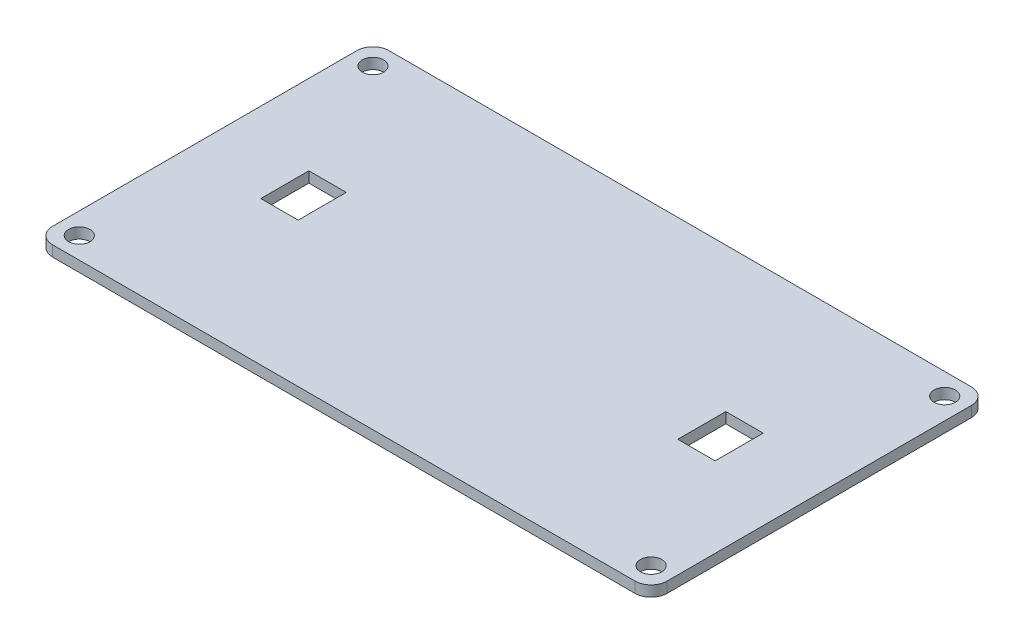
ISO-10303-21;
HEADER;
FILE_DESCRIPTION(('STEP AP214'),'2;1');
FILE_NAME('part.step','',(''),(''),'','','');
FILE_SCHEMA(('AUTOMOTIVE_DESIGN { 1 0 10303 214 1 1 1 1 }'));
ENDSEC;
DATA;
#1=APPLICATION_CONTEXT('core data for automotive mechanical design processes');
#2=APPLICATION_PROTOCOL_DEFINITION('international standard','automotive_design',2000,#1);
#3=PRODUCT_CONTEXT('',#1,'mechanical');
#4=PRODUCT('Part','Part','',(#3));
#5=PRODUCT_RELATED_PRODUCT_CATEGORY('part','',(#4));
#6=PRODUCT_DEFINITION_FORMATION('','',#4);
#7=PRODUCT_DEFINITION_CONTEXT('part definition',#1,'design');
#8=PRODUCT_DEFINITION('design','',#6,#7);
#9=PRODUCT_DEFINITION_SHAPE('','',#8);
#10=(LENGTH_UNIT() NAMED_UNIT(*) SI_UNIT(.MILLI.,.METRE.));
#11=(NAMED_UNIT(*) PLANE_ANGLE_UNIT() SI_UNIT($,.RADIAN.));
#12=(NAMED_UNIT(*) SI_UNIT($,.STERADIAN.) SOLID_ANGLE_UNIT());
#13=UNCERTAINTY_MEASURE_WITH_UNIT(LENGTH_MEASURE(1.E-05),#10,'distance_accuracy_value','');
#14=(GEOMETRIC_REPRESENTATION_CONTEXT(3) GLOBAL_UNCERTAINTY_ASSIGNED_CONTEXT((#13)) GLOBAL_UNIT_ASSIGNED_CONTEXT((#10,
#11,#12)) REPRESENTATION_CONTEXT('',''));
#15=CARTESIAN_POINT('',(0.,0.,0.));
#16=DIRECTION('',(0.,0.,1.));
#17=DIRECTION('',(1.,0.,0.));
#18=AXIS2_PLACEMENT_3D('',#15,#16,#17);
#19=CARTESIAN_POINT('',(-57.5483884452991,2.,31.5));
#20=DIRECTION('',(1.,0.,0.));
#21=DIRECTION('',(0.,0.,-1.));
#22=AXIS2_PLACEMENT_3D('',#19,#20,#21);
#23=PLANE('',#22);
#24=DIRECTION('',(0.,0.,1.));
#25=VECTOR('',#24,1.);
#26=CARTESIAN_POINT('',(-57.5483884452991,0.,31.5));
#27=LINE('',#26,#25);
#28=CARTESIAN_POINT('',(-57.5483884452991,0.,-28.5));
#29=VERTEX_POINT('',#28);
#30=CARTESIAN_POINT('',(-57.5483884452991,0.,28.5));
#31=VERTEX_POINT('',#30);
#32=EDGE_CURVE('E280',#29,#31,#27,.T.);
#33=ORIENTED_EDGE('',*,*,#32,.T.);
#34=DIRECTION('',(0.,-1.,0.));
#35=VECTOR('',#34,1.);
#36=CARTESIAN_POINT('',(-57.5483884452991,2.,28.5));
#37=LINE('',#36,#35);
#38=CARTESIAN_POINT('',(-57.5483884452991,2.,28.5));
#39=VERTEX_POINT('',#38);
#40=EDGE_CURVE('E11',#31,#39,#37,.F.);
#41=ORIENTED_EDGE('',*,*,#40,.T.);
#42=DIRECTION('',(0.,0.,1.));
#43=VECTOR('',#42,1.);
#44=CARTESIAN_POINT('',(-57.5483884452991,2.,31.5));
#45=LINE('',#44,#43);
#46=CARTESIAN_POINT('',(-57.5483884452991,2.,-28.5));
#47=VERTEX_POINT('',#46);
#48=EDGE_CURVE('E284',#47,#39,#45,.T.);
#49=ORIENTED_EDGE('',*,*,#48,.F.);
#50=DIRECTION('',(0.,-1.,0.));
#51=VECTOR('',#50,1.);
#52=CARTESIAN_POINT('',(-57.5483884452991,2.,-28.5));
#53=LINE('',#52,#51);
#54=EDGE_CURVE('E48',#47,#29,#53,.T.);
#55=ORIENTED_EDGE('',*,*,#54,.T.);
#56=EDGE_LOOP('',(#33,#41,#49,#55));
#57=FACE_BOUND('',#56,.T.);
#58=ADVANCED_FACE('F39',(#57),#23,.F.);
#59=CARTESIAN_POINT('',(57.548388445299,2.,31.5));
#60=DIRECTION('',(0.,0.,-1.));
#61=DIRECTION('',(-1.,0.,0.));
#62=AXIS2_PLACEMENT_3D('',#59,#60,#61);
#63=PLANE('',#62);
#64=DIRECTION('',(1.,0.,0.));
#65=VECTOR('',#64,1.);
#66=CARTESIAN_POINT('',(57.548388445299,0.,31.5));
#67=LINE('',#66,#65);
#68=CARTESIAN_POINT('',(-54.5483884452991,0.,31.5));
#69=VERTEX_POINT('',#68);
#70=CARTESIAN_POINT('',(54.548388445299,0.,31.5));
#71=VERTEX_POINT('',#70);
#72=EDGE_CURVE('E305',#69,#71,#67,.T.);
#73=ORIENTED_EDGE('',*,*,#72,.T.);
#74=DIRECTION('',(0.,-1.,0.));
#75=VECTOR('',#74,1.);
#76=CARTESIAN_POINT('',(54.548388445299,2.,31.5));
#77=LINE('',#76,#75);
#78=CARTESIAN_POINT('',(54.548388445299,2.,31.5));
#79=VERTEX_POINT('',#78);
#80=EDGE_CURVE('E357',#71,#79,#77,.F.);
#81=ORIENTED_EDGE('',*,*,#80,.T.);
#82=DIRECTION('',(1.,0.,0.));
#83=VECTOR('',#82,1.);
#84=CARTESIAN_POINT('',(57.548388445299,2.,31.5));
#85=LINE('',#84,#83);
#86=CARTESIAN_POINT('',(-54.5483884452991,2.,31.5));
#87=VERTEX_POINT('',#86);
#88=EDGE_CURVE('E288',#87,#79,#85,.T.);
#89=ORIENTED_EDGE('',*,*,#88,.F.);
#90=DIRECTION('',(0.,-1.,0.));
#91=VECTOR('',#90,1.);
#92=CARTESIAN_POINT('',(-54.5483884452991,2.,31.5));
#93=LINE('',#92,#91);
#94=EDGE_CURVE('E353',#87,#69,#93,.T.);
#95=ORIENTED_EDGE('',*,*,#94,.T.);
#96=EDGE_LOOP('',(#73,#81,#89,#95));
#97=FACE_BOUND('',#96,.T.);
#98=ADVANCED_FACE('F377',(#97),#63,.F.);
#99=CARTESIAN_POINT('',(57.548388445299,2.,-31.5));
#100=DIRECTION('',(-1.,0.,0.));
#101=DIRECTION('',(0.,0.,1.));
#102=AXIS2_PLACEMENT_3D('',#99,#100,#101);
#103=PLANE('',#102);
#104=DIRECTION('',(0.,0.,-1.));
#105=VECTOR('',#104,1.);
#106=CARTESIAN_POINT('',(57.548388445299,0.,-31.5));
#107=LINE('',#106,#105);
#108=CARTESIAN_POINT('',(57.548388445299,0.,28.5));
#109=VERTEX_POINT('',#108);
#110=CARTESIAN_POINT('',(57.548388445299,0.,-28.5));
#111=VERTEX_POINT('',#110);
#112=EDGE_CURVE('E309',#109,#111,#107,.T.);
#113=ORIENTED_EDGE('',*,*,#112,.T.);
#114=DIRECTION('',(0.,-1.,0.));
#115=VECTOR('',#114,1.);
#116=CARTESIAN_POINT('',(57.548388445299,2.,-28.5));
#117=LINE('',#116,#115);
#118=CARTESIAN_POINT('',(57.548388445299,2.,-28.5));
#119=VERTEX_POINT('',#118);
#120=EDGE_CURVE('E338',#111,#119,#117,.F.);
#121=ORIENTED_EDGE('',*,*,#120,.T.);
#122=DIRECTION('',(0.,0.,-1.));
#123=VECTOR('',#122,1.);
#124=CARTESIAN_POINT('',(57.548388445299,2.,-31.5));
#125=LINE('',#124,#123);
#126=CARTESIAN_POINT('',(57.548388445299,2.,28.5));
#127=VERTEX_POINT('',#126);
#128=EDGE_CURVE('E293',#127,#119,#125,.T.);
#129=ORIENTED_EDGE('',*,*,#128,.F.);
#130=DIRECTION('',(0.,-1.,0.));
#131=VECTOR('',#130,1.);
#132=CARTESIAN_POINT('',(57.548388445299,2.,28.5));
#133=LINE('',#132,#131);
#134=EDGE_CURVE('E334',#127,#109,#133,.T.);
#135=ORIENTED_EDGE('',*,*,#134,.T.);
#136=EDGE_LOOP('',(#113,#121,#129,#135));
#137=FACE_BOUND('',#136,.T.);
#138=ADVANCED_FACE('F388',(#137),#103,.F.);
#139=CARTESIAN_POINT('',(-57.5483884452991,2.,-31.5));
#140=DIRECTION('',(0.,0.,1.));
#141=DIRECTION('',(1.,0.,0.));
#142=AXIS2_PLACEMENT_3D('',#139,#140,#141);
#143=PLANE('',#142);
#144=DIRECTION('',(-1.,0.,0.));
#145=VECTOR('',#144,1.);
#146=CARTESIAN_POINT('',(-57.5483884452991,2.,-31.5));
#147=LINE('',#146,#145);
#148=CARTESIAN_POINT('',(54.548388445299,2.,-31.5));
#149=VERTEX_POINT('',#148);
#150=CARTESIAN_POINT('',(-54.5483884452991,2.,-31.5));
#151=VERTEX_POINT('',#150);
#152=EDGE_CURVE('E297',#149,#151,#147,.T.);
#153=ORIENTED_EDGE('',*,*,#152,.F.);
#154=DIRECTION('',(0.,-1.,0.));
#155=VECTOR('',#154,1.);
#156=CARTESIAN_POINT('',(54.548388445299,2.,-31.5));
#157=LINE('',#156,#155);
#158=CARTESIAN_POINT('',(54.548388445299,0.,-31.5));
#159=VERTEX_POINT('',#158);
#160=EDGE_CURVE('E318',#149,#159,#157,.T.);
#161=ORIENTED_EDGE('',*,*,#160,.T.);
#162=DIRECTION('',(-1.,0.,0.));
#163=VECTOR('',#162,1.);
#164=CARTESIAN_POINT('',(-57.5483884452991,0.,-31.5));
#165=LINE('',#164,#163);
#166=CARTESIAN_POINT('',(-54.5483884452991,0.,-31.5));
#167=VERTEX_POINT('',#166);
#168=EDGE_CURVE('E289',#159,#167,#165,.T.);
#169=ORIENTED_EDGE('',*,*,#168,.T.);
#170=DIRECTION('',(0.,-1.,0.));
#171=VECTOR('',#170,1.);
#172=CARTESIAN_POINT('',(-54.5483884452991,2.,-31.5));
#173=LINE('',#172,#171);
#174=EDGE_CURVE('E301',#167,#151,#173,.F.);
#175=ORIENTED_EDGE('',*,*,#174,.T.);
#176=EDGE_LOOP('',(#153,#161,#169,#175));
#177=FACE_BOUND('',#176,.T.);
#178=ADVANCED_FACE('F396',(#177),#143,.F.);
#179=CARTESIAN_POINT('',(0.,2.,0.));
#180=DIRECTION('',(0.,-1.,0.));
#181=DIRECTION('',(0.,0.,-1.));
#182=AXIS2_PLACEMENT_3D('',#179,#180,#181);
#183=PLANE('',#182);
#184=DIRECTION('',(0.,0.,-1.));
#185=VECTOR('',#184,1.);
#186=CARTESIAN_POINT('',(-42.5483884452991,2.,0.));
#187=LINE('',#186,#185);
#188=CARTESIAN_POINT('',(-42.5483884452991,2.,4.5));
#189=VERTEX_POINT('',#188);
#190=CARTESIAN_POINT('',(-42.5483884452991,2.,-4.5));
#191=VERTEX_POINT('',#190);
#192=EDGE_CURVE('E238',#189,#191,#187,.T.);
#193=ORIENTED_EDGE('',*,*,#192,.T.);
#194=DIRECTION('',(1.,0.,0.));
#195=VECTOR('',#194,1.);
#196=CARTESIAN_POINT('',(0.,2.,-4.5));
#197=LINE('',#196,#195);
#198=CARTESIAN_POINT('',(-35.5483884452991,2.,-4.5));
#199=VERTEX_POINT('',#198);
#200=EDGE_CURVE('E157',#191,#199,#197,.T.);
#201=ORIENTED_EDGE('',*,*,#200,.T.);
#202=DIRECTION('',(0.,0.,1.));
#203=VECTOR('',#202,1.);
#204=CARTESIAN_POINT('',(-35.5483884452991,2.,0.));
#205=LINE('',#204,#203);
#206=CARTESIAN_POINT('',(-35.5483884452991,2.,4.5));
#207=VERTEX_POINT('',#206);
#208=EDGE_CURVE('E245',#199,#207,#205,.T.);
#209=ORIENTED_EDGE('',*,*,#208,.T.);
#210=DIRECTION('',(-1.,0.,0.));
#211=VECTOR('',#210,1.);
#212=CARTESIAN_POINT('',(0.,2.,4.5));
#213=LINE('',#212,#211);
#214=EDGE_CURVE('E241',#207,#189,#213,.T.);
#215=ORIENTED_EDGE('',*,*,#214,.T.);
#216=EDGE_LOOP('',(#193,#201,#209,#215));
#217=FACE_BOUND('',#216,.T.);
#218=DIRECTION('',(-1.,0.,0.));
#219=VECTOR('',#218,1.);
#220=CARTESIAN_POINT('',(0.,2.,4.5));
#221=LINE('',#220,#219);
#222=CARTESIAN_POINT('',(42.5483884452991,2.,4.5));
#223=VERTEX_POINT('',#222);
#224=CARTESIAN_POINT('',(35.5483884452991,2.,4.5));
#225=VERTEX_POINT('',#224);
#226=EDGE_CURVE('E191',#223,#225,#221,.T.);
#227=ORIENTED_EDGE('',*,*,#226,.T.);
#228=DIRECTION('',(0.,0.,-1.));
#229=VECTOR('',#228,1.);
#230=CARTESIAN_POINT('',(35.5483884452991,2.,0.));
#231=LINE('',#230,#229);
#232=CARTESIAN_POINT('',(35.5483884452991,2.,-4.5));
#233=VERTEX_POINT('',#232);
#234=EDGE_CURVE('E234',#225,#233,#231,.T.);
#235=ORIENTED_EDGE('',*,*,#234,.T.);
#236=DIRECTION('',(1.,0.,0.));
#237=VECTOR('',#236,1.);
#238=CARTESIAN_POINT('',(0.,2.,-4.5));
#239=LINE('',#238,#237);
#240=CARTESIAN_POINT('',(42.5483884452991,2.,-4.5));
#241=VERTEX_POINT('',#240);
#242=EDGE_CURVE('E230',#233,#241,#239,.T.);
#243=ORIENTED_EDGE('',*,*,#242,.T.);
#244=DIRECTION('',(0.,0.,1.));
#245=VECTOR('',#244,1.);
#246=CARTESIAN_POINT('',(42.5483884452991,2.,0.));
#247=LINE('',#246,#245);
#248=EDGE_CURVE('E226',#241,#223,#247,.T.);
#249=ORIENTED_EDGE('',*,*,#248,.T.);
#250=EDGE_LOOP('',(#227,#235,#243,#249));
#251=FACE_BOUND('',#250,.T.);
#252=CARTESIAN_POINT('',(-53.548388445299,2.,-27.5));
#253=DIRECTION('',(0.,1.,0.));
#254=DIRECTION('',(0.,0.,-1.));
#255=AXIS2_PLACEMENT_3D('',#252,#253,#254);
#256=CIRCLE('',#255,2.);
#257=CARTESIAN_POINT('',(-53.548388445299,2.,-29.5));
#258=VERTEX_POINT('',#257);
#259=EDGE_CURVE('E251',#258,#258,#256,.T.);
#260=ORIENTED_EDGE('',*,*,#259,.F.);
#261=EDGE_LOOP('',(#260));
#262=FACE_BOUND('',#261,.T.);
#263=CARTESIAN_POINT('',(-53.548388445299,2.,27.5));
#264=DIRECTION('',(0.,1.,0.));
#265=DIRECTION('',(0.,0.,1.));
#266=AXIS2_PLACEMENT_3D('',#263,#264,#265);
#267=CIRCLE('',#266,2.);
#268=CARTESIAN_POINT('',(-53.548388445299,2.,29.5));
#269=VERTEX_POINT('',#268);
#270=EDGE_CURVE('E265',#269,#269,#267,.T.);
#271=ORIENTED_EDGE('',*,*,#270,.F.);
#272=EDGE_LOOP('',(#271));
#273=FACE_BOUND('',#272,.T.);
#274=CARTESIAN_POINT('',(53.548388445299,2.,27.5));
#275=DIRECTION('',(0.,1.,0.));
#276=DIRECTION('',(0.,0.,-1.));
#277=AXIS2_PLACEMENT_3D('',#274,#275,#276);
#278=CIRCLE('',#277,2.);
#279=CARTESIAN_POINT('',(53.548388445299,2.,25.5));
#280=VERTEX_POINT('',#279);
#281=EDGE_CURVE('E257',#280,#280,#278,.T.);
#282=ORIENTED_EDGE('',*,*,#281,.F.);
#283=EDGE_LOOP('',(#282));
#284=FACE_BOUND('',#283,.T.);
#285=CARTESIAN_POINT('',(53.548388445299,2.,-27.5));
#286=DIRECTION('',(0.,1.,0.));
#287=DIRECTION('',(0.,0.,1.));
#288=AXIS2_PLACEMENT_3D('',#285,#286,#287);
#289=CIRCLE('',#288,2.);
#290=CARTESIAN_POINT('',(53.548388445299,2.,-25.5));
#291=VERTEX_POINT('',#290);
#292=EDGE_CURVE('E256',#291,#291,#289,.T.);
#293=ORIENTED_EDGE('',*,*,#292,.F.);
#294=EDGE_LOOP('',(#293));
#295=FACE_BOUND('',#294,.T.);
#296=ORIENTED_EDGE('',*,*,#128,.T.);
#297=CARTESIAN_POINT('',(54.548388445299,2.,-28.5));
#298=DIRECTION('',(0.,-1.,0.));
#299=DIRECTION('',(0.,0.,-1.));
#300=AXIS2_PLACEMENT_3D('',#297,#298,#299);
#301=CIRCLE('',#300,3.);
#302=EDGE_CURVE('E350',#119,#149,#301,.F.);
#303=ORIENTED_EDGE('',*,*,#302,.T.);
#304=ORIENTED_EDGE('',*,*,#152,.T.);
#305=CARTESIAN_POINT('',(-54.5483884452991,2.,-28.5));
#306=DIRECTION('',(0.,-1.,0.));
#307=DIRECTION('',(0.,0.,-1.));
#308=AXIS2_PLACEMENT_3D('',#305,#306,#307);
#309=CIRCLE('',#308,3.);
#310=EDGE_CURVE('E341',#151,#47,#309,.F.);
#311=ORIENTED_EDGE('',*,*,#310,.T.);
#312=ORIENTED_EDGE('',*,*,#48,.T.);
#313=CARTESIAN_POINT('',(-54.5483884452991,2.,28.5));
#314=DIRECTION('',(0.,-1.,0.));
#315=DIRECTION('',(0.,0.,-1.));
#316=AXIS2_PLACEMENT_3D('',#313,#314,#315);
#317=CIRCLE('',#316,3.);
#318=EDGE_CURVE('E344',#39,#87,#317,.F.);
#319=ORIENTED_EDGE('',*,*,#318,.T.);
#320=ORIENTED_EDGE('',*,*,#88,.T.);
#321=CARTESIAN_POINT('',(54.548388445299,2.,28.5));
#322=DIRECTION('',(0.,-1.,0.));
#323=DIRECTION('',(0.,0.,-1.));
#324=AXIS2_PLACEMENT_3D('',#321,#322,#323);
#325=CIRCLE('',#324,3.);
#326=EDGE_CURVE('E347',#79,#127,#325,.F.);
#327=ORIENTED_EDGE('',*,*,#326,.T.);
#328=EDGE_LOOP('',(#296,#303,#304,#311,#312,#319,#320,#327));
#329=FACE_BOUND('',#328,.T.);
#330=ADVANCED_FACE('F381',(#217,#251,#262,#273,#284,#295,#329),#183,.F.);
#331=CARTESIAN_POINT('',(0.,0.,0.));
#332=DIRECTION('',(0.,-1.,0.));
#333=DIRECTION('',(0.,0.,-1.));
#334=AXIS2_PLACEMENT_3D('',#331,#332,#333);
#335=PLANE('',#334);
#336=DIRECTION('',(-1.,0.,0.));
#337=VECTOR('',#336,1.);
#338=CARTESIAN_POINT('',(-42.5483884452991,0.,-4.5));
#339=LINE('',#338,#337);
#340=CARTESIAN_POINT('',(-35.5483884452991,0.,-4.5));
#341=VERTEX_POINT('',#340);
#342=CARTESIAN_POINT('',(-42.5483884452991,0.,-4.5));
#343=VERTEX_POINT('',#342);
#344=EDGE_CURVE('E154',#341,#343,#339,.T.);
#345=ORIENTED_EDGE('',*,*,#344,.T.);
#346=DIRECTION('',(0.,0.,1.));
#347=VECTOR('',#346,1.);
#348=CARTESIAN_POINT('',(-42.5483884452991,0.,4.5));
#349=LINE('',#348,#347);
#350=CARTESIAN_POINT('',(-42.5483884452991,0.,4.5));
#351=VERTEX_POINT('',#350);
#352=EDGE_CURVE('E165',#343,#351,#349,.T.);
#353=ORIENTED_EDGE('',*,*,#352,.T.);
#354=DIRECTION('',(1.,0.,0.));
#355=VECTOR('',#354,1.);
#356=CARTESIAN_POINT('',(-35.5483884452991,0.,4.5));
#357=LINE('',#356,#355);
#358=CARTESIAN_POINT('',(-35.5483884452991,0.,4.5));
#359=VERTEX_POINT('',#358);
#360=EDGE_CURVE('E171',#351,#359,#357,.T.);
#361=ORIENTED_EDGE('',*,*,#360,.T.);
#362=DIRECTION('',(0.,0.,-1.));
#363=VECTOR('',#362,1.);
#364=CARTESIAN_POINT('',(-35.5483884452991,0.,-4.5));
#365=LINE('',#364,#363);
#366=EDGE_CURVE('E161',#359,#341,#365,.T.);
#367=ORIENTED_EDGE('',*,*,#366,.T.);
#368=EDGE_LOOP('',(#345,#353,#361,#367));
#369=FACE_BOUND('',#368,.T.);
#370=DIRECTION('',(0.,0.,1.));
#371=VECTOR('',#370,1.);
#372=CARTESIAN_POINT('',(35.5483884452991,0.,-4.5));
#373=LINE('',#372,#371);
#374=CARTESIAN_POINT('',(35.5483884452991,0.,-4.5));
#375=VERTEX_POINT('',#374);
#376=CARTESIAN_POINT('',(35.5483884452991,0.,4.5));
#377=VERTEX_POINT('',#376);
#378=EDGE_CURVE('E198',#375,#377,#373,.T.);
#379=ORIENTED_EDGE('',*,*,#378,.T.);
#380=DIRECTION('',(1.,0.,0.));
#381=VECTOR('',#380,1.);
#382=CARTESIAN_POINT('',(35.5483884452991,0.,4.5));
#383=LINE('',#382,#381);
#384=CARTESIAN_POINT('',(42.5483884452991,0.,4.5));
#385=VERTEX_POINT('',#384);
#386=EDGE_CURVE('E202',#377,#385,#383,.T.);
#387=ORIENTED_EDGE('',*,*,#386,.T.);
#388=DIRECTION('',(0.,0.,-1.));
#389=VECTOR('',#388,1.);
#390=CARTESIAN_POINT('',(42.5483884452991,0.,4.5));
#391=LINE('',#390,#389);
#392=CARTESIAN_POINT('',(42.5483884452991,0.,-4.5));
#393=VERTEX_POINT('',#392);
#394=EDGE_CURVE('E206',#385,#393,#391,.T.);
#395=ORIENTED_EDGE('',*,*,#394,.T.);
#396=DIRECTION('',(-1.,0.,0.));
#397=VECTOR('',#396,1.);
#398=CARTESIAN_POINT('',(42.5483884452991,0.,-4.5));
#399=LINE('',#398,#397);
#400=EDGE_CURVE('E210',#393,#375,#399,.T.);
#401=ORIENTED_EDGE('',*,*,#400,.T.);
#402=EDGE_LOOP('',(#379,#387,#395,#401));
#403=FACE_BOUND('',#402,.T.);
#404=CARTESIAN_POINT('',(-53.548388445299,0.,-27.5));
#405=DIRECTION('',(0.,1.,0.));
#406=DIRECTION('',(0.,0.,-1.));
#407=AXIS2_PLACEMENT_3D('',#404,#405,#406);
#408=CIRCLE('',#407,2.);
#409=CARTESIAN_POINT('',(-53.548388445299,0.,-29.5));
#410=VERTEX_POINT('',#409);
#411=EDGE_CURVE('E269',#410,#410,#408,.T.);
#412=ORIENTED_EDGE('',*,*,#411,.T.);
#413=EDGE_LOOP('',(#412));
#414=FACE_BOUND('',#413,.T.);
#415=CARTESIAN_POINT('',(-53.548388445299,0.,27.5));
#416=DIRECTION('',(0.,1.,0.));
#417=DIRECTION('',(0.,0.,1.));
#418=AXIS2_PLACEMENT_3D('',#415,#416,#417);
#419=CIRCLE('',#418,2.);
#420=CARTESIAN_POINT('',(-53.548388445299,0.,29.5));
#421=VERTEX_POINT('',#420);
#422=EDGE_CURVE('E261',#421,#421,#419,.T.);
#423=ORIENTED_EDGE('',*,*,#422,.T.);
#424=EDGE_LOOP('',(#423));
#425=FACE_BOUND('',#424,.T.);
#426=CARTESIAN_POINT('',(53.548388445299,0.,27.5));
#427=DIRECTION('',(0.,1.,0.));
#428=DIRECTION('',(0.,0.,-1.));
#429=AXIS2_PLACEMENT_3D('',#426,#427,#428);
#430=CIRCLE('',#429,2.);
#431=CARTESIAN_POINT('',(53.548388445299,0.,25.5));
#432=VERTEX_POINT('',#431);
#433=EDGE_CURVE('E252',#432,#432,#430,.T.);
#434=ORIENTED_EDGE('',*,*,#433,.T.);
#435=EDGE_LOOP('',(#434));
#436=FACE_BOUND('',#435,.T.);
#437=CARTESIAN_POINT('',(53.548388445299,0.,-27.5));
#438=DIRECTION('',(0.,1.,0.));
#439=DIRECTION('',(0.,0.,1.));
#440=AXIS2_PLACEMENT_3D('',#437,#438,#439);
#441=CIRCLE('',#440,2.);
#442=CARTESIAN_POINT('',(53.548388445299,0.,-25.5));
#443=VERTEX_POINT('',#442);
#444=EDGE_CURVE('E276',#443,#443,#441,.T.);
#445=ORIENTED_EDGE('',*,*,#444,.T.);
#446=EDGE_LOOP('',(#445));
#447=FACE_BOUND('',#446,.T.);
#448=ORIENTED_EDGE('',*,*,#168,.F.);
#449=CARTESIAN_POINT('',(54.548388445299,0.,-28.5));
#450=DIRECTION('',(0.,-1.,0.));
#451=DIRECTION('',(0.,0.,-1.));
#452=AXIS2_PLACEMENT_3D('',#449,#450,#451);
#453=CIRCLE('',#452,3.);
#454=EDGE_CURVE('E331',#159,#111,#453,.T.);
#455=ORIENTED_EDGE('',*,*,#454,.T.);
#456=ORIENTED_EDGE('',*,*,#112,.F.);
#457=CARTESIAN_POINT('',(54.548388445299,0.,28.5));
#458=DIRECTION('',(0.,-1.,0.));
#459=DIRECTION('',(0.,0.,-1.));
#460=AXIS2_PLACEMENT_3D('',#457,#458,#459);
#461=CIRCLE('',#460,3.);
#462=EDGE_CURVE('E328',#109,#71,#461,.T.);
#463=ORIENTED_EDGE('',*,*,#462,.T.);
#464=ORIENTED_EDGE('',*,*,#72,.F.);
#465=CARTESIAN_POINT('',(-54.5483884452991,0.,28.5));
#466=DIRECTION('',(0.,-1.,0.));
#467=DIRECTION('',(0.,0.,-1.));
#468=AXIS2_PLACEMENT_3D('',#465,#466,#467);
#469=CIRCLE('',#468,3.);
#470=EDGE_CURVE('E325',#69,#31,#469,.T.);
#471=ORIENTED_EDGE('',*,*,#470,.T.);
#472=ORIENTED_EDGE('',*,*,#32,.F.);
#473=CARTESIAN_POINT('',(-54.5483884452991,0.,-28.5));
#474=DIRECTION('',(0.,-1.,0.));
#475=DIRECTION('',(0.,0.,-1.));
#476=AXIS2_PLACEMENT_3D('',#473,#474,#475);
#477=CIRCLE('',#476,3.);
#478=EDGE_CURVE('E322',#29,#167,#477,.T.);
#479=ORIENTED_EDGE('',*,*,#478,.T.);
#480=EDGE_LOOP('',(#448,#455,#456,#463,#464,#471,#472,#479));
#481=FACE_BOUND('',#480,.T.);
#482=ADVANCED_FACE('F173',(#369,#403,#414,#425,#436,#447,#481),#335,.T.);
#483=CARTESIAN_POINT('',(53.548388445299,0.,-27.5));
#484=DIRECTION('',(0.,1.,0.));
#485=DIRECTION('',(0.,0.,1.));
#486=AXIS2_PLACEMENT_3D('',#483,#484,#485);
#487=CYLINDRICAL_SURFACE('',#486,2.);
#488=ORIENTED_EDGE('',*,*,#444,.F.);
#489=EDGE_LOOP('',(#488));
#490=FACE_BOUND('',#489,.T.);
#491=ORIENTED_EDGE('',*,*,#292,.T.);
#492=EDGE_LOOP('',(#491));
#493=FACE_BOUND('',#492,.T.);
#494=ADVANCED_FACE('F453',(#490,#493),#487,.F.);
#495=CARTESIAN_POINT('',(53.548388445299,0.,27.5));
#496=DIRECTION('',(0.,1.,0.));
#497=DIRECTION('',(0.,0.,1.));
#498=AXIS2_PLACEMENT_3D('',#495,#496,#497);
#499=CYLINDRICAL_SURFACE('',#498,2.);
#500=ORIENTED_EDGE('',*,*,#433,.F.);
#501=EDGE_LOOP('',(#500));
#502=FACE_BOUND('',#501,.T.);
#503=ORIENTED_EDGE('',*,*,#281,.T.);
#504=EDGE_LOOP('',(#503));
#505=FACE_BOUND('',#504,.T.);
#506=ADVANCED_FACE('F529',(#502,#505),#499,.F.);
#507=CARTESIAN_POINT('',(-53.548388445299,0.,27.5));
#508=DIRECTION('',(0.,1.,0.));
#509=DIRECTION('',(0.,0.,1.));
#510=AXIS2_PLACEMENT_3D('',#507,#508,#509);
#511=CYLINDRICAL_SURFACE('',#510,2.);
#512=ORIENTED_EDGE('',*,*,#422,.F.);
#513=EDGE_LOOP('',(#512));
#514=FACE_BOUND('',#513,.T.);
#515=ORIENTED_EDGE('',*,*,#270,.T.);
#516=EDGE_LOOP('',(#515));
#517=FACE_BOUND('',#516,.T.);
#518=ADVANCED_FACE('F532',(#514,#517),#511,.F.);
#519=CARTESIAN_POINT('',(-53.548388445299,0.,-27.5));
#520=DIRECTION('',(0.,1.,0.));
#521=DIRECTION('',(0.,0.,1.));
#522=AXIS2_PLACEMENT_3D('',#519,#520,#521);
#523=CYLINDRICAL_SURFACE('',#522,2.);
#524=ORIENTED_EDGE('',*,*,#411,.F.);
#525=EDGE_LOOP('',(#524));
#526=FACE_BOUND('',#525,.T.);
#527=ORIENTED_EDGE('',*,*,#259,.T.);
#528=EDGE_LOOP('',(#527));
#529=FACE_BOUND('',#528,.T.);
#530=ADVANCED_FACE('F417',(#526,#529),#523,.F.);
#531=CARTESIAN_POINT('',(54.548388445299,2.,-28.5));
#532=DIRECTION('',(0.,-1.,0.));
#533=DIRECTION('',(0.,0.,-1.));
#534=AXIS2_PLACEMENT_3D('',#531,#532,#533);
#535=CYLINDRICAL_SURFACE('',#534,3.);
#536=ORIENTED_EDGE('',*,*,#302,.F.);
#537=ORIENTED_EDGE('',*,*,#120,.F.);
#538=ORIENTED_EDGE('',*,*,#454,.F.);
#539=ORIENTED_EDGE('',*,*,#160,.F.);
#540=EDGE_LOOP('',(#536,#537,#538,#539));
#541=FACE_BOUND('',#540,.T.);
#542=ADVANCED_FACE('F393',(#541),#535,.T.);
#543=CARTESIAN_POINT('',(54.548388445299,2.,28.5));
#544=DIRECTION('',(0.,-1.,0.));
#545=DIRECTION('',(0.,0.,-1.));
#546=AXIS2_PLACEMENT_3D('',#543,#544,#545);
#547=CYLINDRICAL_SURFACE('',#546,3.);
#548=ORIENTED_EDGE('',*,*,#326,.F.);
#549=ORIENTED_EDGE('',*,*,#80,.F.);
#550=ORIENTED_EDGE('',*,*,#462,.F.);
#551=ORIENTED_EDGE('',*,*,#134,.F.);
#552=EDGE_LOOP('',(#548,#549,#550,#551));
#553=FACE_BOUND('',#552,.T.);
#554=ADVANCED_FACE('F385',(#553),#547,.T.);
#555=CARTESIAN_POINT('',(-54.5483884452991,2.,28.5));
#556=DIRECTION('',(0.,-1.,0.));
#557=DIRECTION('',(0.,0.,-1.));
#558=AXIS2_PLACEMENT_3D('',#555,#556,#557);
#559=CYLINDRICAL_SURFACE('',#558,3.);
#560=ORIENTED_EDGE('',*,*,#318,.F.);
#561=ORIENTED_EDGE('',*,*,#40,.F.);
#562=ORIENTED_EDGE('',*,*,#470,.F.);
#563=ORIENTED_EDGE('',*,*,#94,.F.);
#564=EDGE_LOOP('',(#560,#561,#562,#563));
#565=FACE_BOUND('',#564,.T.);
#566=ADVANCED_FACE('F374',(#565),#559,.T.);
#567=CARTESIAN_POINT('',(-54.5483884452991,2.,-28.5));
#568=DIRECTION('',(0.,-1.,0.));
#569=DIRECTION('',(0.,0.,-1.));
#570=AXIS2_PLACEMENT_3D('',#567,#568,#569);
#571=CYLINDRICAL_SURFACE('',#570,3.);
#572=ORIENTED_EDGE('',*,*,#310,.F.);
#573=ORIENTED_EDGE('',*,*,#174,.F.);
#574=ORIENTED_EDGE('',*,*,#478,.F.);
#575=ORIENTED_EDGE('',*,*,#54,.F.);
#576=EDGE_LOOP('',(#572,#573,#574,#575));
#577=FACE_BOUND('',#576,.T.);
#578=ADVANCED_FACE('F41',(#577),#571,.T.);
#579=CARTESIAN_POINT('',(35.5483884452991,0.,-4.5));
#580=DIRECTION('',(-1.,0.,0.));
#581=DIRECTION('',(0.,0.,1.));
#582=AXIS2_PLACEMENT_3D('',#579,#580,#581);
#583=PLANE('',#582);
#584=DIRECTION('',(0.,1.,0.));
#585=VECTOR('',#584,1.);
#586=CARTESIAN_POINT('',(35.5483884452991,0.,4.5));
#587=LINE('',#586,#585);
#588=EDGE_CURVE('E63',#377,#225,#587,.T.);
#589=ORIENTED_EDGE('',*,*,#588,.F.);
#590=ORIENTED_EDGE('',*,*,#378,.F.);
#591=DIRECTION('',(0.,1.,0.));
#592=VECTOR('',#591,1.);
#593=CARTESIAN_POINT('',(35.5483884452991,0.,-4.5));
#594=LINE('',#593,#592);
#595=EDGE_CURVE('E177',#375,#233,#594,.T.);
#596=ORIENTED_EDGE('',*,*,#595,.T.);
#597=ORIENTED_EDGE('',*,*,#234,.F.);
#598=EDGE_LOOP('',(#589,#590,#596,#597));
#599=FACE_BOUND('',#598,.T.);
#600=ADVANCED_FACE('F399',(#599),#583,.F.);
#601=CARTESIAN_POINT('',(42.5483884452991,0.,-4.5));
#602=DIRECTION('',(0.,0.,-1.));
#603=DIRECTION('',(-1.,0.,0.));
#604=AXIS2_PLACEMENT_3D('',#601,#602,#603);
#605=PLANE('',#604);
#606=ORIENTED_EDGE('',*,*,#595,.F.);
#607=ORIENTED_EDGE('',*,*,#400,.F.);
#608=DIRECTION('',(0.,1.,0.));
#609=VECTOR('',#608,1.);
#610=CARTESIAN_POINT('',(42.5483884452991,0.,-4.5));
#611=LINE('',#610,#609);
#612=EDGE_CURVE('E181',#393,#241,#611,.T.);
#613=ORIENTED_EDGE('',*,*,#612,.T.);
#614=ORIENTED_EDGE('',*,*,#242,.F.);
#615=EDGE_LOOP('',(#606,#607,#613,#614));
#616=FACE_BOUND('',#615,.T.);
#617=ADVANCED_FACE('F404',(#616),#605,.F.);
#618=CARTESIAN_POINT('',(42.5483884452991,0.,4.5));
#619=DIRECTION('',(1.,0.,0.));
#620=DIRECTION('',(0.,0.,-1.));
#621=AXIS2_PLACEMENT_3D('',#618,#619,#620);
#622=PLANE('',#621);
#623=ORIENTED_EDGE('',*,*,#612,.F.);
#624=ORIENTED_EDGE('',*,*,#394,.F.);
#625=DIRECTION('',(0.,1.,0.));
#626=VECTOR('',#625,1.);
#627=CARTESIAN_POINT('',(42.5483884452991,0.,4.5));
#628=LINE('',#627,#626);
#629=EDGE_CURVE('E217',#385,#223,#628,.T.);
#630=ORIENTED_EDGE('',*,*,#629,.T.);
#631=ORIENTED_EDGE('',*,*,#248,.F.);
#632=EDGE_LOOP('',(#623,#624,#630,#631));
#633=FACE_BOUND('',#632,.T.);
#634=ADVANCED_FACE('F469',(#633),#622,.F.);
#635=CARTESIAN_POINT('',(35.5483884452991,0.,4.5));
#636=DIRECTION('',(0.,0.,1.));
#637=DIRECTION('',(1.,0.,0.));
#638=AXIS2_PLACEMENT_3D('',#635,#636,#637);
#639=PLANE('',#638);
#640=ORIENTED_EDGE('',*,*,#629,.F.);
#641=ORIENTED_EDGE('',*,*,#386,.F.);
#642=ORIENTED_EDGE('',*,*,#588,.T.);
#643=ORIENTED_EDGE('',*,*,#226,.F.);
#644=EDGE_LOOP('',(#640,#641,#642,#643));
#645=FACE_BOUND('',#644,.T.);
#646=ADVANCED_FACE('F479',(#645),#639,.F.);
#647=CARTESIAN_POINT('',(-42.5483884452991,0.,-4.5));
#648=DIRECTION('',(0.,0.,-1.));
#649=DIRECTION('',(-1.,0.,0.));
#650=AXIS2_PLACEMENT_3D('',#647,#648,#649);
#651=PLANE('',#650);
#652=DIRECTION('',(0.,1.,0.));
#653=VECTOR('',#652,1.);
#654=CARTESIAN_POINT('',(-42.5483884452991,0.,-4.5));
#655=LINE('',#654,#653);
#656=EDGE_CURVE('E55',#343,#191,#655,.T.);
#657=ORIENTED_EDGE('',*,*,#656,.F.);
#658=ORIENTED_EDGE('',*,*,#344,.F.);
#659=DIRECTION('',(0.,1.,0.));
#660=VECTOR('',#659,1.);
#661=CARTESIAN_POINT('',(-35.5483884452991,0.,-4.5));
#662=LINE('',#661,#660);
#663=EDGE_CURVE('E188',#341,#199,#662,.T.);
#664=ORIENTED_EDGE('',*,*,#663,.T.);
#665=ORIENTED_EDGE('',*,*,#200,.F.);
#666=EDGE_LOOP('',(#657,#658,#664,#665));
#667=FACE_BOUND('',#666,.T.);
#668=ADVANCED_FACE('F151',(#667),#651,.F.);
#669=CARTESIAN_POINT('',(-35.5483884452991,0.,-4.5));
#670=DIRECTION('',(1.,0.,0.));
#671=DIRECTION('',(0.,0.,-1.));
#672=AXIS2_PLACEMENT_3D('',#669,#670,#671);
#673=PLANE('',#672);
#674=ORIENTED_EDGE('',*,*,#663,.F.);
#675=ORIENTED_EDGE('',*,*,#366,.F.);
#676=DIRECTION('',(0.,1.,0.));
#677=VECTOR('',#676,1.);
#678=CARTESIAN_POINT('',(-35.5483884452991,0.,4.5));
#679=LINE('',#678,#677);
#680=EDGE_CURVE('E192',#359,#207,#679,.T.);
#681=ORIENTED_EDGE('',*,*,#680,.T.);
#682=ORIENTED_EDGE('',*,*,#208,.F.);
#683=EDGE_LOOP('',(#674,#675,#681,#682));
#684=FACE_BOUND('',#683,.T.);
#685=ADVANCED_FACE('F497',(#684),#673,.F.);
#686=CARTESIAN_POINT('',(-35.5483884452991,0.,4.5));
#687=DIRECTION('',(0.,0.,1.));
#688=DIRECTION('',(1.,0.,0.));
#689=AXIS2_PLACEMENT_3D('',#686,#687,#688);
#690=PLANE('',#689);
#691=ORIENTED_EDGE('',*,*,#680,.F.);
#692=ORIENTED_EDGE('',*,*,#360,.F.);
#693=DIRECTION('',(0.,1.,0.));
#694=VECTOR('',#693,1.);
#695=CARTESIAN_POINT('',(-42.5483884452991,0.,4.5));
#696=LINE('',#695,#694);
#697=EDGE_CURVE('E160',#351,#189,#696,.T.);
#698=ORIENTED_EDGE('',*,*,#697,.T.);
#699=ORIENTED_EDGE('',*,*,#214,.F.);
#700=EDGE_LOOP('',(#691,#692,#698,#699));
#701=FACE_BOUND('',#700,.T.);
#702=ADVANCED_FACE('F506',(#701),#690,.F.);
#703=CARTESIAN_POINT('',(-42.5483884452991,0.,4.5));
#704=DIRECTION('',(-1.,0.,0.));
#705=DIRECTION('',(0.,0.,1.));
#706=AXIS2_PLACEMENT_3D('',#703,#704,#705);
#707=PLANE('',#706);
#708=ORIENTED_EDGE('',*,*,#697,.F.);
#709=ORIENTED_EDGE('',*,*,#352,.F.);
#710=ORIENTED_EDGE('',*,*,#656,.T.);
#711=ORIENTED_EDGE('',*,*,#192,.F.);
#712=EDGE_LOOP('',(#708,#709,#710,#711));
#713=FACE_BOUND('',#712,.T.);
#714=ADVANCED_FACE('F166',(#713),#707,.F.);
#715=CLOSED_SHELL('',(#58,#98,#138,#178,#330,#482,#494,#506,#518,#530,#542,#554,#566,#578,#600,
#617,#634,#646,#668,#685,#702,#714));
#716=MANIFOLD_SOLID_BREP('B2',#715);
#717=ADVANCED_BREP_SHAPE_REPRESENTATION('',(#18,#716),#14);
#718=SHAPE_DEFINITION_REPRESENTATION(#9,#717);
ENDSEC;
END-ISO-10303-21;
